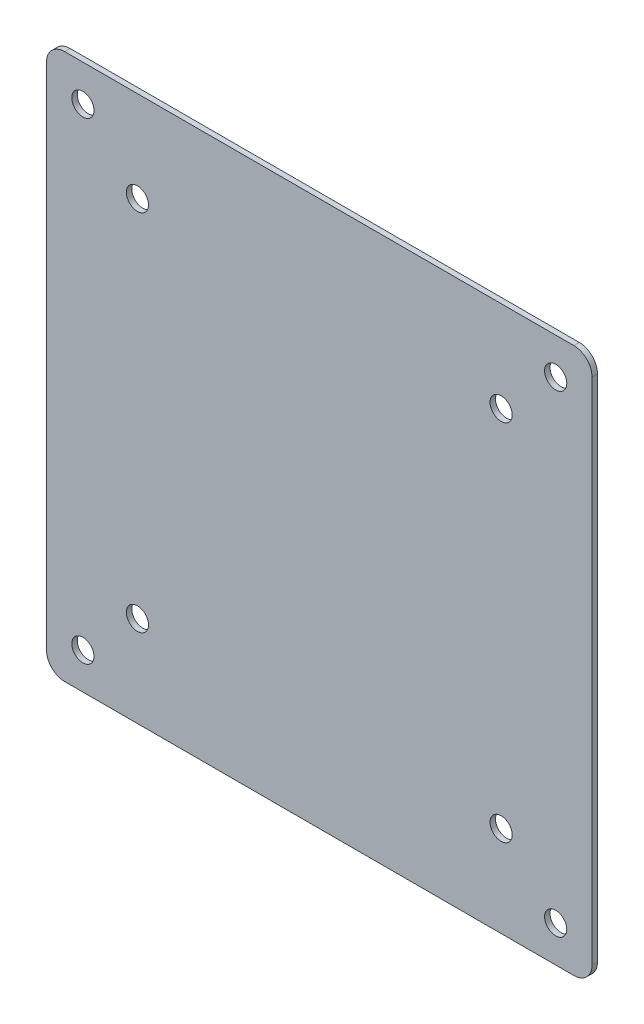
ISO-10303-21;
HEADER;
FILE_DESCRIPTION(('STEP AP214'),'2;1');
FILE_NAME('part.step','',(''),(''),'','','');
FILE_SCHEMA(('AUTOMOTIVE_DESIGN { 1 0 10303 214 1 1 1 1 }'));
ENDSEC;
DATA;
#1=APPLICATION_CONTEXT('core data for automotive mechanical design processes');
#2=APPLICATION_PROTOCOL_DEFINITION('international standard','automotive_design',2000,#1);
#3=PRODUCT_CONTEXT('',#1,'mechanical');
#4=PRODUCT('Part','Part','',(#3));
#5=PRODUCT_RELATED_PRODUCT_CATEGORY('part','',(#4));
#6=PRODUCT_DEFINITION_FORMATION('','',#4);
#7=PRODUCT_DEFINITION_CONTEXT('part definition',#1,'design');
#8=PRODUCT_DEFINITION('design','',#6,#7);
#9=PRODUCT_DEFINITION_SHAPE('','',#8);
#10=(LENGTH_UNIT() NAMED_UNIT(*) SI_UNIT(.MILLI.,.METRE.));
#11=(NAMED_UNIT(*) PLANE_ANGLE_UNIT() SI_UNIT($,.RADIAN.));
#12=(NAMED_UNIT(*) SI_UNIT($,.STERADIAN.) SOLID_ANGLE_UNIT());
#13=UNCERTAINTY_MEASURE_WITH_UNIT(LENGTH_MEASURE(1.E-05),#10,'distance_accuracy_value','');
#14=(GEOMETRIC_REPRESENTATION_CONTEXT(3) GLOBAL_UNCERTAINTY_ASSIGNED_CONTEXT((#13)) GLOBAL_UNIT_ASSIGNED_CONTEXT((#10,
#11,#12)) REPRESENTATION_CONTEXT('',''));
#15=CARTESIAN_POINT('',(0.,0.,0.));
#16=DIRECTION('',(0.,0.,1.));
#17=DIRECTION('',(1.,0.,0.));
#18=AXIS2_PLACEMENT_3D('',#15,#16,#17);
#19=CARTESIAN_POINT('',(150.,150.,3.));
#20=DIRECTION('',(-1.,0.,0.));
#21=DIRECTION('',(0.,0.,1.));
#22=AXIS2_PLACEMENT_3D('',#19,#20,#21);
#23=PLANE('',#22);
#24=DIRECTION('',(0.,1.,0.));
#25=VECTOR('',#24,1.);
#26=CARTESIAN_POINT('',(150.,150.,0.));
#27=LINE('',#26,#25);
#28=CARTESIAN_POINT('',(150.,-140.,0.));
#29=VERTEX_POINT('',#28);
#30=CARTESIAN_POINT('',(150.,140.,0.));
#31=VERTEX_POINT('',#30);
#32=EDGE_CURVE('E137',#29,#31,#27,.T.);
#33=ORIENTED_EDGE('',*,*,#32,.T.);
#34=DIRECTION('',(0.,0.,-1.));
#35=VECTOR('',#34,1.);
#36=CARTESIAN_POINT('',(150.,140.,3.));
#37=LINE('',#36,#35);
#38=CARTESIAN_POINT('',(150.,140.,3.));
#39=VERTEX_POINT('',#38);
#40=EDGE_CURVE('E111',#31,#39,#37,.F.);
#41=ORIENTED_EDGE('',*,*,#40,.T.);
#42=DIRECTION('',(0.,1.,0.));
#43=VECTOR('',#42,1.);
#44=CARTESIAN_POINT('',(150.,150.,3.));
#45=LINE('',#44,#43);
#46=CARTESIAN_POINT('',(150.,-140.,3.));
#47=VERTEX_POINT('',#46);
#48=EDGE_CURVE('E150',#47,#39,#45,.T.);
#49=ORIENTED_EDGE('',*,*,#48,.F.);
#50=DIRECTION('',(0.,0.,-1.));
#51=VECTOR('',#50,1.);
#52=CARTESIAN_POINT('',(150.,-140.,3.));
#53=LINE('',#52,#51);
#54=EDGE_CURVE('E117',#47,#29,#53,.T.);
#55=ORIENTED_EDGE('',*,*,#54,.T.);
#56=EDGE_LOOP('',(#33,#41,#49,#55));
#57=FACE_BOUND('',#56,.T.);
#58=ADVANCED_FACE('F38',(#57),#23,.F.);
#59=CARTESIAN_POINT('',(-150.,150.,3.));
#60=DIRECTION('',(0.,-1.,0.));
#61=DIRECTION('',(0.,0.,-1.));
#62=AXIS2_PLACEMENT_3D('',#59,#60,#61);
#63=PLANE('',#62);
#64=DIRECTION('',(-1.,0.,0.));
#65=VECTOR('',#64,1.);
#66=CARTESIAN_POINT('',(-150.,150.,3.));
#67=LINE('',#66,#65);
#68=CARTESIAN_POINT('',(140.,150.,3.));
#69=VERTEX_POINT('',#68);
#70=CARTESIAN_POINT('',(-140.,150.,3.));
#71=VERTEX_POINT('',#70);
#72=EDGE_CURVE('E127',#69,#71,#67,.T.);
#73=ORIENTED_EDGE('',*,*,#72,.F.);
#74=DIRECTION('',(0.,0.,-1.));
#75=VECTOR('',#74,1.);
#76=CARTESIAN_POINT('',(140.,150.,3.));
#77=LINE('',#76,#75);
#78=CARTESIAN_POINT('',(140.,150.,0.));
#79=VERTEX_POINT('',#78);
#80=EDGE_CURVE('E110',#69,#79,#77,.T.);
#81=ORIENTED_EDGE('',*,*,#80,.T.);
#82=DIRECTION('',(-1.,0.,0.));
#83=VECTOR('',#82,1.);
#84=CARTESIAN_POINT('',(-150.,150.,0.));
#85=LINE('',#84,#83);
#86=CARTESIAN_POINT('',(-140.,150.,0.));
#87=VERTEX_POINT('',#86);
#88=EDGE_CURVE('E124',#79,#87,#85,.T.);
#89=ORIENTED_EDGE('',*,*,#88,.T.);
#90=DIRECTION('',(0.,0.,-1.));
#91=VECTOR('',#90,1.);
#92=CARTESIAN_POINT('',(-140.,150.,3.));
#93=LINE('',#92,#91);
#94=EDGE_CURVE('E130',#87,#71,#93,.F.);
#95=ORIENTED_EDGE('',*,*,#94,.T.);
#96=EDGE_LOOP('',(#73,#81,#89,#95));
#97=FACE_BOUND('',#96,.T.);
#98=ADVANCED_FACE('F123',(#97),#63,.F.);
#99=CARTESIAN_POINT('',(-150.,150.,3.));
#100=DIRECTION('',(1.,0.,0.));
#101=DIRECTION('',(0.,0.,-1.));
#102=AXIS2_PLACEMENT_3D('',#99,#100,#101);
#103=PLANE('',#102);
#104=DIRECTION('',(0.,-1.,0.));
#105=VECTOR('',#104,1.);
#106=CARTESIAN_POINT('',(-150.,150.,3.));
#107=LINE('',#106,#105);
#108=CARTESIAN_POINT('',(-150.,140.,3.));
#109=VERTEX_POINT('',#108);
#110=CARTESIAN_POINT('',(-150.,-140.,3.));
#111=VERTEX_POINT('',#110);
#112=EDGE_CURVE('E203',#109,#111,#107,.T.);
#113=ORIENTED_EDGE('',*,*,#112,.F.);
#114=DIRECTION('',(0.,0.,-1.));
#115=VECTOR('',#114,1.);
#116=CARTESIAN_POINT('',(-150.,140.,3.));
#117=LINE('',#116,#115);
#118=CARTESIAN_POINT('',(-150.,140.,0.));
#119=VERTEX_POINT('',#118);
#120=EDGE_CURVE('E11',#109,#119,#117,.T.);
#121=ORIENTED_EDGE('',*,*,#120,.T.);
#122=DIRECTION('',(0.,-1.,0.));
#123=VECTOR('',#122,1.);
#124=CARTESIAN_POINT('',(-150.,150.,0.));
#125=LINE('',#124,#123);
#126=CARTESIAN_POINT('',(-150.,-140.,0.));
#127=VERTEX_POINT('',#126);
#128=EDGE_CURVE('E136',#119,#127,#125,.T.);
#129=ORIENTED_EDGE('',*,*,#128,.T.);
#130=DIRECTION('',(0.,0.,-1.));
#131=VECTOR('',#130,1.);
#132=CARTESIAN_POINT('',(-150.,-140.,3.));
#133=LINE('',#132,#131);
#134=EDGE_CURVE('E47',#127,#111,#133,.F.);
#135=ORIENTED_EDGE('',*,*,#134,.T.);
#136=EDGE_LOOP('',(#113,#121,#129,#135));
#137=FACE_BOUND('',#136,.T.);
#138=ADVANCED_FACE('F202',(#137),#103,.F.);
#139=CARTESIAN_POINT('',(-150.,-150.,3.));
#140=DIRECTION('',(0.,1.,0.));
#141=DIRECTION('',(0.,0.,1.));
#142=AXIS2_PLACEMENT_3D('',#139,#140,#141);
#143=PLANE('',#142);
#144=DIRECTION('',(1.,0.,0.));
#145=VECTOR('',#144,1.);
#146=CARTESIAN_POINT('',(-150.,-150.,0.));
#147=LINE('',#146,#145);
#148=CARTESIAN_POINT('',(-140.,-150.,0.));
#149=VERTEX_POINT('',#148);
#150=CARTESIAN_POINT('',(140.,-150.,0.));
#151=VERTEX_POINT('',#150);
#152=EDGE_CURVE('E142',#149,#151,#147,.T.);
#153=ORIENTED_EDGE('',*,*,#152,.T.);
#154=DIRECTION('',(0.,0.,-1.));
#155=VECTOR('',#154,1.);
#156=CARTESIAN_POINT('',(140.,-150.,3.));
#157=LINE('',#156,#155);
#158=CARTESIAN_POINT('',(140.,-150.,3.));
#159=VERTEX_POINT('',#158);
#160=EDGE_CURVE('E54',#151,#159,#157,.F.);
#161=ORIENTED_EDGE('',*,*,#160,.T.);
#162=DIRECTION('',(1.,0.,0.));
#163=VECTOR('',#162,1.);
#164=CARTESIAN_POINT('',(-150.,-150.,3.));
#165=LINE('',#164,#163);
#166=CARTESIAN_POINT('',(-140.,-150.,3.));
#167=VERTEX_POINT('',#166);
#168=EDGE_CURVE('E169',#167,#159,#165,.T.);
#169=ORIENTED_EDGE('',*,*,#168,.F.);
#170=DIRECTION('',(0.,0.,-1.));
#171=VECTOR('',#170,1.);
#172=CARTESIAN_POINT('',(-140.,-150.,3.));
#173=LINE('',#172,#171);
#174=EDGE_CURVE('E193',#167,#149,#173,.T.);
#175=ORIENTED_EDGE('',*,*,#174,.T.);
#176=EDGE_LOOP('',(#153,#161,#169,#175));
#177=FACE_BOUND('',#176,.T.);
#178=ADVANCED_FACE('F213',(#177),#143,.F.);
#179=CARTESIAN_POINT('',(0.,0.,3.));
#180=DIRECTION('',(0.,0.,1.));
#181=DIRECTION('',(1.,0.,0.));
#182=AXIS2_PLACEMENT_3D('',#179,#180,#181);
#183=PLANE('',#182);
#184=CARTESIAN_POINT('',(-130.,-130.,3.));
#185=DIRECTION('',(0.,0.,1.));
#186=DIRECTION('',(1.,0.,0.));
#187=AXIS2_PLACEMENT_3D('',#184,#185,#186);
#188=CIRCLE('',#187,6.09999999999999);
#189=CARTESIAN_POINT('',(-123.9,-130.,3.));
#190=VERTEX_POINT('',#189);
#191=EDGE_CURVE('E167',#190,#190,#188,.T.);
#192=ORIENTED_EDGE('',*,*,#191,.F.);
#193=EDGE_LOOP('',(#192));
#194=FACE_BOUND('',#193,.T.);
#195=CARTESIAN_POINT('',(-100.,-100.,3.));
#196=DIRECTION('',(0.,0.,1.));
#197=DIRECTION('',(1.,0.,0.));
#198=AXIS2_PLACEMENT_3D('',#195,#196,#197);
#199=CIRCLE('',#198,6.09999999999999);
#200=CARTESIAN_POINT('',(-93.9,-100.,3.));
#201=VERTEX_POINT('',#200);
#202=EDGE_CURVE('E162',#201,#201,#199,.T.);
#203=ORIENTED_EDGE('',*,*,#202,.F.);
#204=EDGE_LOOP('',(#203));
#205=FACE_BOUND('',#204,.T.);
#206=CARTESIAN_POINT('',(130.,-130.,3.));
#207=DIRECTION('',(0.,0.,1.));
#208=DIRECTION('',(1.,0.,0.));
#209=AXIS2_PLACEMENT_3D('',#206,#207,#208);
#210=CIRCLE('',#209,6.09999999999999);
#211=CARTESIAN_POINT('',(136.1,-130.,3.));
#212=VERTEX_POINT('',#211);
#213=EDGE_CURVE('E161',#212,#212,#210,.T.);
#214=ORIENTED_EDGE('',*,*,#213,.F.);
#215=EDGE_LOOP('',(#214));
#216=FACE_BOUND('',#215,.T.);
#217=CARTESIAN_POINT('',(100.,-100.,3.));
#218=DIRECTION('',(0.,0.,1.));
#219=DIRECTION('',(1.,0.,0.));
#220=AXIS2_PLACEMENT_3D('',#217,#218,#219);
#221=CIRCLE('',#220,6.09999999999999);
#222=CARTESIAN_POINT('',(106.1,-100.,3.));
#223=VERTEX_POINT('',#222);
#224=EDGE_CURVE('E156',#223,#223,#221,.T.);
#225=ORIENTED_EDGE('',*,*,#224,.F.);
#226=EDGE_LOOP('',(#225));
#227=FACE_BOUND('',#226,.T.);
#228=CARTESIAN_POINT('',(130.,130.,3.));
#229=DIRECTION('',(0.,0.,1.));
#230=DIRECTION('',(1.,0.,0.));
#231=AXIS2_PLACEMENT_3D('',#228,#229,#230);
#232=CIRCLE('',#231,6.09999999999999);
#233=CARTESIAN_POINT('',(136.1,130.,3.));
#234=VERTEX_POINT('',#233);
#235=EDGE_CURVE('E155',#234,#234,#232,.T.);
#236=ORIENTED_EDGE('',*,*,#235,.F.);
#237=EDGE_LOOP('',(#236));
#238=FACE_BOUND('',#237,.T.);
#239=CARTESIAN_POINT('',(-100.,100.,3.));
#240=DIRECTION('',(0.,0.,1.));
#241=DIRECTION('',(1.,0.,0.));
#242=AXIS2_PLACEMENT_3D('',#239,#240,#241);
#243=CIRCLE('',#242,6.09999999999999);
#244=CARTESIAN_POINT('',(-93.9,100.,3.));
#245=VERTEX_POINT('',#244);
#246=EDGE_CURVE('E245',#245,#245,#243,.T.);
#247=ORIENTED_EDGE('',*,*,#246,.F.);
#248=EDGE_LOOP('',(#247));
#249=FACE_BOUND('',#248,.T.);
#250=CARTESIAN_POINT('',(-130.,130.,3.));
#251=DIRECTION('',(0.,0.,1.));
#252=DIRECTION('',(1.,0.,0.));
#253=AXIS2_PLACEMENT_3D('',#250,#251,#252);
#254=CIRCLE('',#253,6.09999999999999);
#255=CARTESIAN_POINT('',(-123.9,130.,3.));
#256=VERTEX_POINT('',#255);
#257=EDGE_CURVE('E237',#256,#256,#254,.T.);
#258=ORIENTED_EDGE('',*,*,#257,.F.);
#259=EDGE_LOOP('',(#258));
#260=FACE_BOUND('',#259,.T.);
#261=CARTESIAN_POINT('',(100.,100.,3.));
#262=DIRECTION('',(0.,0.,1.));
#263=DIRECTION('',(1.,0.,0.));
#264=AXIS2_PLACEMENT_3D('',#261,#262,#263);
#265=CIRCLE('',#264,6.09999999999999);
#266=CARTESIAN_POINT('',(106.1,100.,3.));
#267=VERTEX_POINT('',#266);
#268=EDGE_CURVE('E229',#267,#267,#265,.T.);
#269=ORIENTED_EDGE('',*,*,#268,.F.);
#270=EDGE_LOOP('',(#269));
#271=FACE_BOUND('',#270,.T.);
#272=ORIENTED_EDGE('',*,*,#48,.T.);
#273=CARTESIAN_POINT('',(140.,140.,3.));
#274=DIRECTION('',(0.,0.,1.));
#275=DIRECTION('',(1.,0.,0.));
#276=AXIS2_PLACEMENT_3D('',#273,#274,#275);
#277=CIRCLE('',#276,10.);
#278=EDGE_CURVE('E190',#39,#69,#277,.T.);
#279=ORIENTED_EDGE('',*,*,#278,.T.);
#280=ORIENTED_EDGE('',*,*,#72,.T.);
#281=CARTESIAN_POINT('',(-140.,140.,3.));
#282=DIRECTION('',(0.,0.,1.));
#283=DIRECTION('',(1.,0.,0.));
#284=AXIS2_PLACEMENT_3D('',#281,#282,#283);
#285=CIRCLE('',#284,10.);
#286=EDGE_CURVE('E184',#71,#109,#285,.T.);
#287=ORIENTED_EDGE('',*,*,#286,.T.);
#288=ORIENTED_EDGE('',*,*,#112,.T.);
#289=CARTESIAN_POINT('',(-140.,-140.,3.));
#290=DIRECTION('',(0.,0.,1.));
#291=DIRECTION('',(1.,0.,0.));
#292=AXIS2_PLACEMENT_3D('',#289,#290,#291);
#293=CIRCLE('',#292,10.);
#294=EDGE_CURVE('E61',#111,#167,#293,.T.);
#295=ORIENTED_EDGE('',*,*,#294,.T.);
#296=ORIENTED_EDGE('',*,*,#168,.T.);
#297=CARTESIAN_POINT('',(140.,-140.,3.));
#298=DIRECTION('',(0.,0.,1.));
#299=DIRECTION('',(1.,0.,0.));
#300=AXIS2_PLACEMENT_3D('',#297,#298,#299);
#301=CIRCLE('',#300,10.);
#302=EDGE_CURVE('E187',#159,#47,#301,.T.);
#303=ORIENTED_EDGE('',*,*,#302,.T.);
#304=EDGE_LOOP('',(#272,#279,#280,#287,#288,#295,#296,#303));
#305=FACE_BOUND('',#304,.T.);
#306=ADVANCED_FACE('F207',(#194,#205,#216,#227,#238,#249,#260,#271,#305),#183,.T.);
#307=CARTESIAN_POINT('',(0.,0.,0.));
#308=DIRECTION('',(0.,0.,1.));
#309=DIRECTION('',(1.,0.,0.));
#310=AXIS2_PLACEMENT_3D('',#307,#308,#309);
#311=PLANE('',#310);
#312=CARTESIAN_POINT('',(-130.,-130.,0.));
#313=DIRECTION('',(0.,0.,1.));
#314=DIRECTION('',(1.,0.,0.));
#315=AXIS2_PLACEMENT_3D('',#312,#313,#314);
#316=CIRCLE('',#315,6.09999999999999);
#317=CARTESIAN_POINT('',(-123.9,-130.,0.));
#318=VERTEX_POINT('',#317);
#319=EDGE_CURVE('E163',#318,#318,#316,.T.);
#320=ORIENTED_EDGE('',*,*,#319,.T.);
#321=EDGE_LOOP('',(#320));
#322=FACE_BOUND('',#321,.T.);
#323=CARTESIAN_POINT('',(-100.,-100.,0.));
#324=DIRECTION('',(0.,0.,1.));
#325=DIRECTION('',(1.,0.,0.));
#326=AXIS2_PLACEMENT_3D('',#323,#324,#325);
#327=CIRCLE('',#326,6.09999999999999);
#328=CARTESIAN_POINT('',(-93.9,-100.,0.));
#329=VERTEX_POINT('',#328);
#330=EDGE_CURVE('E157',#329,#329,#327,.T.);
#331=ORIENTED_EDGE('',*,*,#330,.T.);
#332=EDGE_LOOP('',(#331));
#333=FACE_BOUND('',#332,.T.);
#334=CARTESIAN_POINT('',(130.,-130.,0.));
#335=DIRECTION('',(0.,0.,1.));
#336=DIRECTION('',(1.,0.,0.));
#337=AXIS2_PLACEMENT_3D('',#334,#335,#336);
#338=CIRCLE('',#337,6.09999999999999);
#339=CARTESIAN_POINT('',(136.1,-130.,0.));
#340=VERTEX_POINT('',#339);
#341=EDGE_CURVE('E259',#340,#340,#338,.T.);
#342=ORIENTED_EDGE('',*,*,#341,.T.);
#343=EDGE_LOOP('',(#342));
#344=FACE_BOUND('',#343,.T.);
#345=CARTESIAN_POINT('',(100.,-100.,0.));
#346=DIRECTION('',(0.,0.,1.));
#347=DIRECTION('',(1.,0.,0.));
#348=AXIS2_PLACEMENT_3D('',#345,#346,#347);
#349=CIRCLE('',#348,6.09999999999999);
#350=CARTESIAN_POINT('',(106.1,-100.,0.));
#351=VERTEX_POINT('',#350);
#352=EDGE_CURVE('E151',#351,#351,#349,.T.);
#353=ORIENTED_EDGE('',*,*,#352,.T.);
#354=EDGE_LOOP('',(#353));
#355=FACE_BOUND('',#354,.T.);
#356=CARTESIAN_POINT('',(130.,130.,0.));
#357=DIRECTION('',(0.,0.,1.));
#358=DIRECTION('',(1.,0.,0.));
#359=AXIS2_PLACEMENT_3D('',#356,#357,#358);
#360=CIRCLE('',#359,6.09999999999999);
#361=CARTESIAN_POINT('',(136.1,130.,0.));
#362=VERTEX_POINT('',#361);
#363=EDGE_CURVE('E249',#362,#362,#360,.T.);
#364=ORIENTED_EDGE('',*,*,#363,.T.);
#365=EDGE_LOOP('',(#364));
#366=FACE_BOUND('',#365,.T.);
#367=CARTESIAN_POINT('',(-100.,100.,0.));
#368=DIRECTION('',(0.,0.,1.));
#369=DIRECTION('',(1.,0.,0.));
#370=AXIS2_PLACEMENT_3D('',#367,#368,#369);
#371=CIRCLE('',#370,6.09999999999999);
#372=CARTESIAN_POINT('',(-93.9,100.,0.));
#373=VERTEX_POINT('',#372);
#374=EDGE_CURVE('E241',#373,#373,#371,.T.);
#375=ORIENTED_EDGE('',*,*,#374,.T.);
#376=EDGE_LOOP('',(#375));
#377=FACE_BOUND('',#376,.T.);
#378=CARTESIAN_POINT('',(-130.,130.,0.));
#379=DIRECTION('',(0.,0.,1.));
#380=DIRECTION('',(1.,0.,0.));
#381=AXIS2_PLACEMENT_3D('',#378,#379,#380);
#382=CIRCLE('',#381,6.09999999999999);
#383=CARTESIAN_POINT('',(-123.9,130.,0.));
#384=VERTEX_POINT('',#383);
#385=EDGE_CURVE('E233',#384,#384,#382,.T.);
#386=ORIENTED_EDGE('',*,*,#385,.T.);
#387=EDGE_LOOP('',(#386));
#388=FACE_BOUND('',#387,.T.);
#389=CARTESIAN_POINT('',(100.,100.,0.));
#390=DIRECTION('',(0.,0.,1.));
#391=DIRECTION('',(1.,0.,0.));
#392=AXIS2_PLACEMENT_3D('',#389,#390,#391);
#393=CIRCLE('',#392,6.09999999999999);
#394=CARTESIAN_POINT('',(106.1,100.,0.));
#395=VERTEX_POINT('',#394);
#396=EDGE_CURVE('E144',#395,#395,#393,.T.);
#397=ORIENTED_EDGE('',*,*,#396,.T.);
#398=EDGE_LOOP('',(#397));
#399=FACE_BOUND('',#398,.T.);
#400=ORIENTED_EDGE('',*,*,#88,.F.);
#401=CARTESIAN_POINT('',(140.,140.,0.));
#402=DIRECTION('',(0.,0.,1.));
#403=DIRECTION('',(1.,0.,0.));
#404=AXIS2_PLACEMENT_3D('',#401,#402,#403);
#405=CIRCLE('',#404,10.);
#406=EDGE_CURVE('E106',#79,#31,#405,.F.);
#407=ORIENTED_EDGE('',*,*,#406,.T.);
#408=ORIENTED_EDGE('',*,*,#32,.F.);
#409=CARTESIAN_POINT('',(140.,-140.,0.));
#410=DIRECTION('',(0.,0.,1.));
#411=DIRECTION('',(1.,0.,0.));
#412=AXIS2_PLACEMENT_3D('',#409,#410,#411);
#413=CIRCLE('',#412,10.);
#414=EDGE_CURVE('E118',#29,#151,#413,.F.);
#415=ORIENTED_EDGE('',*,*,#414,.T.);
#416=ORIENTED_EDGE('',*,*,#152,.F.);
#417=CARTESIAN_POINT('',(-140.,-140.,0.));
#418=DIRECTION('',(0.,0.,1.));
#419=DIRECTION('',(1.,0.,0.));
#420=AXIS2_PLACEMENT_3D('',#417,#418,#419);
#421=CIRCLE('',#420,10.);
#422=EDGE_CURVE('E129',#149,#127,#421,.F.);
#423=ORIENTED_EDGE('',*,*,#422,.T.);
#424=ORIENTED_EDGE('',*,*,#128,.F.);
#425=CARTESIAN_POINT('',(-140.,140.,0.));
#426=DIRECTION('',(0.,0.,1.));
#427=DIRECTION('',(1.,0.,0.));
#428=AXIS2_PLACEMENT_3D('',#425,#426,#427);
#429=CIRCLE('',#428,10.);
#430=EDGE_CURVE('E134',#119,#87,#429,.F.);
#431=ORIENTED_EDGE('',*,*,#430,.T.);
#432=EDGE_LOOP('',(#400,#407,#408,#415,#416,#423,#424,#431));
#433=FACE_BOUND('',#432,.T.);
#434=ADVANCED_FACE('F132',(#322,#333,#344,#355,#366,#377,#388,#399,#433),#311,.F.);
#435=CARTESIAN_POINT('',(100.,100.,3.));
#436=DIRECTION('',(0.,0.,1.));
#437=DIRECTION('',(1.,0.,0.));
#438=AXIS2_PLACEMENT_3D('',#435,#436,#437);
#439=CYLINDRICAL_SURFACE('',#438,6.09999999999999);
#440=ORIENTED_EDGE('',*,*,#268,.T.);
#441=EDGE_LOOP('',(#440));
#442=FACE_BOUND('',#441,.T.);
#443=ORIENTED_EDGE('',*,*,#396,.F.);
#444=EDGE_LOOP('',(#443));
#445=FACE_BOUND('',#444,.T.);
#446=ADVANCED_FACE('F293',(#442,#445),#439,.F.);
#447=CARTESIAN_POINT('',(-130.,130.,3.));
#448=DIRECTION('',(0.,0.,1.));
#449=DIRECTION('',(1.,0.,0.));
#450=AXIS2_PLACEMENT_3D('',#447,#448,#449);
#451=CYLINDRICAL_SURFACE('',#450,6.09999999999999);
#452=ORIENTED_EDGE('',*,*,#257,.T.);
#453=EDGE_LOOP('',(#452));
#454=FACE_BOUND('',#453,.T.);
#455=ORIENTED_EDGE('',*,*,#385,.F.);
#456=EDGE_LOOP('',(#455));
#457=FACE_BOUND('',#456,.T.);
#458=ADVANCED_FACE('F296',(#454,#457),#451,.F.);
#459=CARTESIAN_POINT('',(-100.,100.,3.));
#460=DIRECTION('',(0.,0.,1.));
#461=DIRECTION('',(1.,0.,0.));
#462=AXIS2_PLACEMENT_3D('',#459,#460,#461);
#463=CYLINDRICAL_SURFACE('',#462,6.09999999999999);
#464=ORIENTED_EDGE('',*,*,#246,.T.);
#465=EDGE_LOOP('',(#464));
#466=FACE_BOUND('',#465,.T.);
#467=ORIENTED_EDGE('',*,*,#374,.F.);
#468=EDGE_LOOP('',(#467));
#469=FACE_BOUND('',#468,.T.);
#470=ADVANCED_FACE('F381',(#466,#469),#463,.F.);
#471=CARTESIAN_POINT('',(130.,130.,3.));
#472=DIRECTION('',(0.,0.,1.));
#473=DIRECTION('',(1.,0.,0.));
#474=AXIS2_PLACEMENT_3D('',#471,#472,#473);
#475=CYLINDRICAL_SURFACE('',#474,6.09999999999999);
#476=ORIENTED_EDGE('',*,*,#235,.T.);
#477=EDGE_LOOP('',(#476));
#478=FACE_BOUND('',#477,.T.);
#479=ORIENTED_EDGE('',*,*,#363,.F.);
#480=EDGE_LOOP('',(#479));
#481=FACE_BOUND('',#480,.T.);
#482=ADVANCED_FACE('F373',(#478,#481),#475,.F.);
#483=CARTESIAN_POINT('',(100.,-100.,3.));
#484=DIRECTION('',(0.,0.,1.));
#485=DIRECTION('',(1.,0.,0.));
#486=AXIS2_PLACEMENT_3D('',#483,#484,#485);
#487=CYLINDRICAL_SURFACE('',#486,6.09999999999999);
#488=ORIENTED_EDGE('',*,*,#224,.T.);
#489=EDGE_LOOP('',(#488));
#490=FACE_BOUND('',#489,.T.);
#491=ORIENTED_EDGE('',*,*,#352,.F.);
#492=EDGE_LOOP('',(#491));
#493=FACE_BOUND('',#492,.T.);
#494=ADVANCED_FACE('F365',(#490,#493),#487,.F.);
#495=CARTESIAN_POINT('',(130.,-130.,3.));
#496=DIRECTION('',(0.,0.,1.));
#497=DIRECTION('',(1.,0.,0.));
#498=AXIS2_PLACEMENT_3D('',#495,#496,#497);
#499=CYLINDRICAL_SURFACE('',#498,6.09999999999999);
#500=ORIENTED_EDGE('',*,*,#213,.T.);
#501=EDGE_LOOP('',(#500));
#502=FACE_BOUND('',#501,.T.);
#503=ORIENTED_EDGE('',*,*,#341,.F.);
#504=EDGE_LOOP('',(#503));
#505=FACE_BOUND('',#504,.T.);
#506=ADVANCED_FACE('F357',(#502,#505),#499,.F.);
#507=CARTESIAN_POINT('',(-100.,-100.,3.));
#508=DIRECTION('',(0.,0.,1.));
#509=DIRECTION('',(1.,0.,0.));
#510=AXIS2_PLACEMENT_3D('',#507,#508,#509);
#511=CYLINDRICAL_SURFACE('',#510,6.09999999999999);
#512=ORIENTED_EDGE('',*,*,#202,.T.);
#513=EDGE_LOOP('',(#512));
#514=FACE_BOUND('',#513,.T.);
#515=ORIENTED_EDGE('',*,*,#330,.F.);
#516=EDGE_LOOP('',(#515));
#517=FACE_BOUND('',#516,.T.);
#518=ADVANCED_FACE('F351',(#514,#517),#511,.F.);
#519=CARTESIAN_POINT('',(-130.,-130.,3.));
#520=DIRECTION('',(0.,0.,1.));
#521=DIRECTION('',(1.,0.,0.));
#522=AXIS2_PLACEMENT_3D('',#519,#520,#521);
#523=CYLINDRICAL_SURFACE('',#522,6.09999999999999);
#524=ORIENTED_EDGE('',*,*,#191,.T.);
#525=EDGE_LOOP('',(#524));
#526=FACE_BOUND('',#525,.T.);
#527=ORIENTED_EDGE('',*,*,#319,.F.);
#528=EDGE_LOOP('',(#527));
#529=FACE_BOUND('',#528,.T.);
#530=ADVANCED_FACE('F273',(#526,#529),#523,.F.);
#531=CARTESIAN_POINT('',(140.,140.,3.));
#532=DIRECTION('',(0.,0.,-1.));
#533=DIRECTION('',(-1.,0.,0.));
#534=AXIS2_PLACEMENT_3D('',#531,#532,#533);
#535=CYLINDRICAL_SURFACE('',#534,10.);
#536=ORIENTED_EDGE('',*,*,#278,.F.);
#537=ORIENTED_EDGE('',*,*,#40,.F.);
#538=ORIENTED_EDGE('',*,*,#406,.F.);
#539=ORIENTED_EDGE('',*,*,#80,.F.);
#540=EDGE_LOOP('',(#536,#537,#538,#539));
#541=FACE_BOUND('',#540,.T.);
#542=ADVANCED_FACE('F109',(#541),#535,.T.);
#543=CARTESIAN_POINT('',(140.,-140.,3.));
#544=DIRECTION('',(0.,0.,-1.));
#545=DIRECTION('',(-1.,0.,0.));
#546=AXIS2_PLACEMENT_3D('',#543,#544,#545);
#547=CYLINDRICAL_SURFACE('',#546,10.);
#548=ORIENTED_EDGE('',*,*,#302,.F.);
#549=ORIENTED_EDGE('',*,*,#160,.F.);
#550=ORIENTED_EDGE('',*,*,#414,.F.);
#551=ORIENTED_EDGE('',*,*,#54,.F.);
#552=EDGE_LOOP('',(#548,#549,#550,#551));
#553=FACE_BOUND('',#552,.T.);
#554=ADVANCED_FACE('F217',(#553),#547,.T.);
#555=CARTESIAN_POINT('',(-140.,140.,3.));
#556=DIRECTION('',(0.,0.,-1.));
#557=DIRECTION('',(-1.,0.,0.));
#558=AXIS2_PLACEMENT_3D('',#555,#556,#557);
#559=CYLINDRICAL_SURFACE('',#558,10.);
#560=ORIENTED_EDGE('',*,*,#286,.F.);
#561=ORIENTED_EDGE('',*,*,#94,.F.);
#562=ORIENTED_EDGE('',*,*,#430,.F.);
#563=ORIENTED_EDGE('',*,*,#120,.F.);
#564=EDGE_LOOP('',(#560,#561,#562,#563));
#565=FACE_BOUND('',#564,.T.);
#566=ADVANCED_FACE('F320',(#565),#559,.T.);
#567=CARTESIAN_POINT('',(-140.,-140.,3.));
#568=DIRECTION('',(0.,0.,-1.));
#569=DIRECTION('',(-1.,0.,0.));
#570=AXIS2_PLACEMENT_3D('',#567,#568,#569);
#571=CYLINDRICAL_SURFACE('',#570,10.);
#572=ORIENTED_EDGE('',*,*,#294,.F.);
#573=ORIENTED_EDGE('',*,*,#134,.F.);
#574=ORIENTED_EDGE('',*,*,#422,.F.);
#575=ORIENTED_EDGE('',*,*,#174,.F.);
#576=EDGE_LOOP('',(#572,#573,#574,#575));
#577=FACE_BOUND('',#576,.T.);
#578=ADVANCED_FACE('F40',(#577),#571,.T.);
#579=CLOSED_SHELL('',(#58,#98,#138,#178,#306,#434,#446,#458,#470,#482,#494,#506,#518,#530,#542,
#554,#566,#578));
#580=MANIFOLD_SOLID_BREP('B2',#579);
#581=ADVANCED_BREP_SHAPE_REPRESENTATION('',(#18,#580),#14);
#582=SHAPE_DEFINITION_REPRESENTATION(#9,#581);
ENDSEC;
END-ISO-10303-21;
